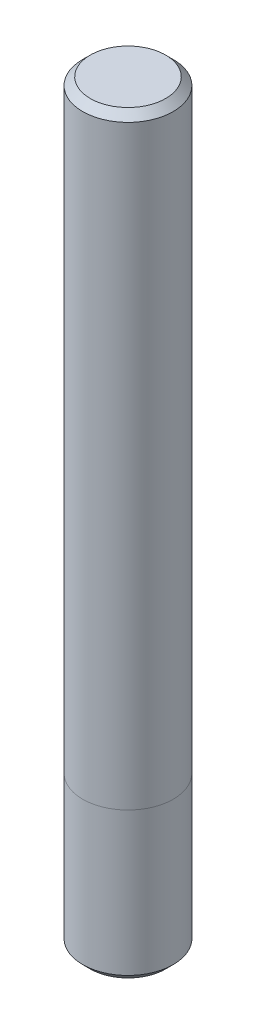
ISO-10303-21;
HEADER;
FILE_DESCRIPTION(('STEP AP214'),'2;1');
FILE_NAME('part.step','',(''),(''),'','','');
FILE_SCHEMA(('AUTOMOTIVE_DESIGN { 1 0 10303 214 1 1 1 1 }'));
ENDSEC;
DATA;
#1=APPLICATION_CONTEXT('core data for automotive mechanical design processes');
#2=APPLICATION_PROTOCOL_DEFINITION('international standard','automotive_design',2000,#1);
#3=PRODUCT_CONTEXT('',#1,'mechanical');
#4=PRODUCT('Part','Part','',(#3));
#5=PRODUCT_RELATED_PRODUCT_CATEGORY('part','',(#4));
#6=PRODUCT_DEFINITION_FORMATION('','',#4);
#7=PRODUCT_DEFINITION_CONTEXT('part definition',#1,'design');
#8=PRODUCT_DEFINITION('design','',#6,#7);
#9=PRODUCT_DEFINITION_SHAPE('','',#8);
#10=(LENGTH_UNIT() NAMED_UNIT(*) SI_UNIT(.MILLI.,.METRE.));
#11=(NAMED_UNIT(*) PLANE_ANGLE_UNIT() SI_UNIT($,.RADIAN.));
#12=(NAMED_UNIT(*) SI_UNIT($,.STERADIAN.) SOLID_ANGLE_UNIT());
#13=UNCERTAINTY_MEASURE_WITH_UNIT(LENGTH_MEASURE(1.E-05),#10,'distance_accuracy_value','');
#14=(GEOMETRIC_REPRESENTATION_CONTEXT(3) GLOBAL_UNCERTAINTY_ASSIGNED_CONTEXT((#13)) GLOBAL_UNIT_ASSIGNED_CONTEXT((#10,
#11,#12)) REPRESENTATION_CONTEXT('',''));
#15=CARTESIAN_POINT('',(0.,0.,0.));
#16=DIRECTION('',(0.,0.,1.));
#17=DIRECTION('',(1.,0.,0.));
#18=AXIS2_PLACEMENT_3D('',#15,#16,#17);
#19=CARTESIAN_POINT('',(0.,12.5,0.));
#20=DIRECTION('',(0.,-1.,0.));
#21=DIRECTION('',(0.,0.,-1.));
#22=AXIS2_PLACEMENT_3D('',#19,#20,#21);
#23=CYLINDRICAL_SURFACE('',#22,1.5);
#24=CARTESIAN_POINT('',(0.,-12.25,0.));
#25=DIRECTION('',(0.,1.,0.));
#26=DIRECTION('',(0.,0.,1.));
#27=AXIS2_PLACEMENT_3D('',#24,#25,#26);
#28=CIRCLE('',#27,1.5);
#29=CARTESIAN_POINT('',(0.,-12.25,1.5));
#30=VERTEX_POINT('',#29);
#31=EDGE_CURVE('E67',#30,#30,#28,.T.);
#32=ORIENTED_EDGE('',*,*,#31,.T.);
#33=EDGE_LOOP('',(#32));
#34=FACE_BOUND('',#33,.T.);
#35=CARTESIAN_POINT('',(0.,-7.5,0.));
#36=DIRECTION('',(0.,1.,0.));
#37=DIRECTION('',(-1.,0.,0.));
#38=AXIS2_PLACEMENT_3D('',#35,#36,#37);
#39=CIRCLE('',#38,1.5);
#40=CARTESIAN_POINT('',(-1.5,-7.5,0.));
#41=VERTEX_POINT('',#40);
#42=CARTESIAN_POINT('',(1.5,-7.5,0.));
#43=VERTEX_POINT('',#42);
#44=EDGE_CURVE('E11',#41,#43,#39,.T.);
#45=ORIENTED_EDGE('',*,*,#44,.F.);
#46=EDGE_CURVE('E44',#43,#41,#39,.T.);
#47=ORIENTED_EDGE('',*,*,#46,.F.);
#48=EDGE_LOOP('',(#45,#47));
#49=FACE_BOUND('',#48,.T.);
#50=ADVANCED_FACE('F39',(#34,#49),#23,.T.);
#51=ORIENTED_EDGE('',*,*,#46,.T.);
#52=ORIENTED_EDGE('',*,*,#44,.T.);
#53=EDGE_LOOP('',(#51,#52));
#54=FACE_BOUND('',#53,.T.);
#55=CARTESIAN_POINT('',(0.,12.25,0.));
#56=DIRECTION('',(0.,1.,0.));
#57=DIRECTION('',(0.,0.,1.));
#58=AXIS2_PLACEMENT_3D('',#55,#56,#57);
#59=CIRCLE('',#58,1.5);
#60=CARTESIAN_POINT('',(0.,12.25,1.5));
#61=VERTEX_POINT('',#60);
#62=EDGE_CURVE('E72',#61,#61,#59,.F.);
#63=ORIENTED_EDGE('',*,*,#62,.T.);
#64=EDGE_LOOP('',(#63));
#65=FACE_BOUND('',#64,.T.);
#66=ADVANCED_FACE('F56',(#54,#65),#23,.T.);
#67=CARTESIAN_POINT('',(0.,12.5,0.));
#68=DIRECTION('',(0.,1.,0.));
#69=DIRECTION('',(0.,0.,1.));
#70=AXIS2_PLACEMENT_3D('',#67,#68,#69);
#71=PLANE('',#70);
#72=CARTESIAN_POINT('',(0.,12.5,0.));
#73=DIRECTION('',(0.,1.,0.));
#74=DIRECTION('',(0.,0.,1.));
#75=AXIS2_PLACEMENT_3D('',#72,#73,#74);
#76=CIRCLE('',#75,1.25);
#77=CARTESIAN_POINT('',(0.,12.5,1.25));
#78=VERTEX_POINT('',#77);
#79=EDGE_CURVE('E59',#78,#78,#76,.T.);
#80=ORIENTED_EDGE('',*,*,#79,.T.);
#81=EDGE_LOOP('',(#80));
#82=FACE_BOUND('',#81,.T.);
#83=ADVANCED_FACE('F91',(#82),#71,.T.);
#84=CARTESIAN_POINT('',(0.,-12.5,0.));
#85=DIRECTION('',(0.,1.,0.));
#86=DIRECTION('',(0.,0.,1.));
#87=AXIS2_PLACEMENT_3D('',#84,#85,#86);
#88=PLANE('',#87);
#89=CARTESIAN_POINT('',(0.,-12.5,0.));
#90=DIRECTION('',(0.,1.,0.));
#91=DIRECTION('',(0.,0.,1.));
#92=AXIS2_PLACEMENT_3D('',#89,#90,#91);
#93=CIRCLE('',#92,1.25);
#94=CARTESIAN_POINT('',(0.,-12.5,1.25));
#95=VERTEX_POINT('',#94);
#96=EDGE_CURVE('E63',#95,#95,#93,.F.);
#97=ORIENTED_EDGE('',*,*,#96,.T.);
#98=EDGE_LOOP('',(#97));
#99=FACE_BOUND('',#98,.T.);
#100=ADVANCED_FACE('F83',(#99),#88,.F.);
#101=CARTESIAN_POINT('',(0.,-12.25,0.));
#102=DIRECTION('',(0.,1.,0.));
#103=DIRECTION('',(0.,0.,1.));
#104=AXIS2_PLACEMENT_3D('',#101,#102,#103);
#105=CONICAL_SURFACE('',#104,1.5,0.785398163397453);
#106=ORIENTED_EDGE('',*,*,#96,.F.);
#107=EDGE_LOOP('',(#106));
#108=FACE_BOUND('',#107,.T.);
#109=ORIENTED_EDGE('',*,*,#31,.F.);
#110=EDGE_LOOP('',(#109));
#111=FACE_BOUND('',#110,.T.);
#112=ADVANCED_FACE('F78',(#108,#111),#105,.T.);
#113=CARTESIAN_POINT('',(0.,12.5,0.));
#114=DIRECTION('',(0.,-1.,0.));
#115=DIRECTION('',(0.,0.,-1.));
#116=AXIS2_PLACEMENT_3D('',#113,#114,#115);
#117=CONICAL_SURFACE('',#116,1.25,0.785398163397446);
#118=ORIENTED_EDGE('',*,*,#62,.F.);
#119=EDGE_LOOP('',(#118));
#120=FACE_BOUND('',#119,.T.);
#121=ORIENTED_EDGE('',*,*,#79,.F.);
#122=EDGE_LOOP('',(#121));
#123=FACE_BOUND('',#122,.T.);
#124=ADVANCED_FACE('F42',(#120,#123),#117,.T.);
#125=CLOSED_SHELL('',(#50,#66,#83,#100,#112,#124));
#126=MANIFOLD_SOLID_BREP('B2',#125);
#127=ADVANCED_BREP_SHAPE_REPRESENTATION('',(#18,#126),#14);
#128=SHAPE_DEFINITION_REPRESENTATION(#9,#127);
ENDSEC;
END-ISO-10303-21;
